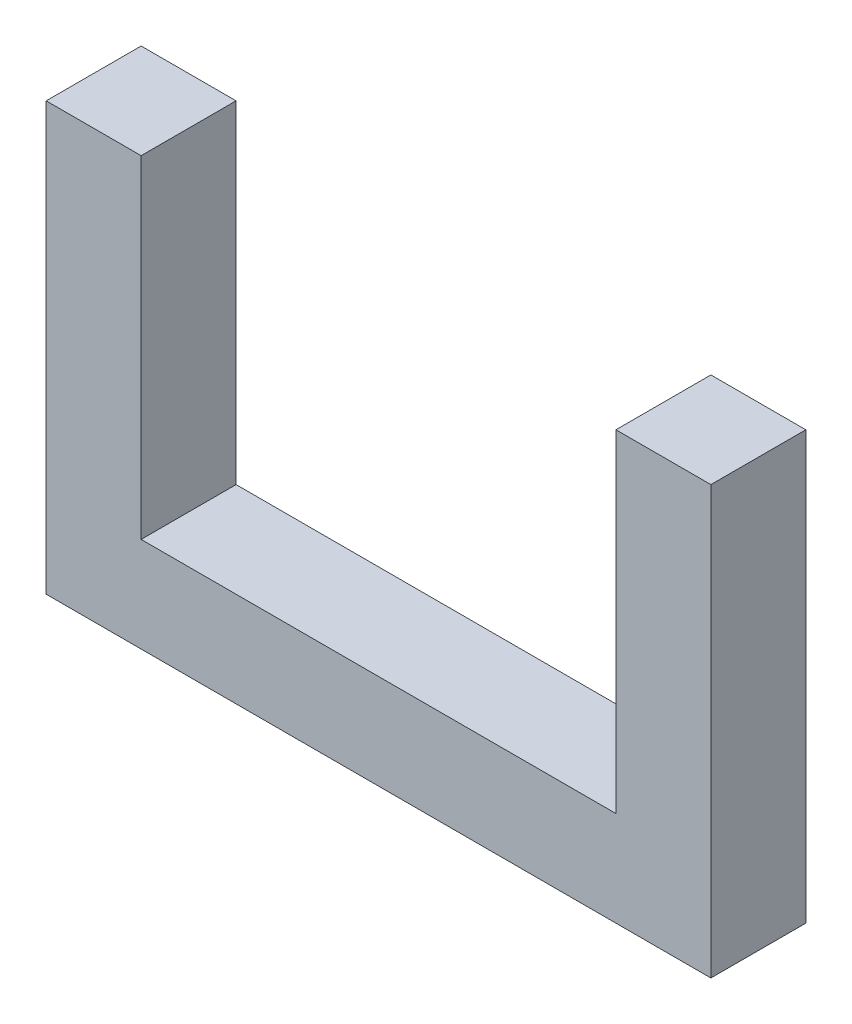
ISO-10303-21;
HEADER;
FILE_DESCRIPTION(('STEP AP214'),'2;1');
FILE_NAME('part.step','',(''),(''),'','','');
FILE_SCHEMA(('AUTOMOTIVE_DESIGN { 1 0 10303 214 1 1 1 1 }'));
ENDSEC;
DATA;
#1=APPLICATION_CONTEXT('core data for automotive mechanical design processes');
#2=APPLICATION_PROTOCOL_DEFINITION('international standard','automotive_design',2000,#1);
#3=PRODUCT_CONTEXT('',#1,'mechanical');
#4=PRODUCT('Part','Part','',(#3));
#5=PRODUCT_RELATED_PRODUCT_CATEGORY('part','',(#4));
#6=PRODUCT_DEFINITION_FORMATION('','',#4);
#7=PRODUCT_DEFINITION_CONTEXT('part definition',#1,'design');
#8=PRODUCT_DEFINITION('design','',#6,#7);
#9=PRODUCT_DEFINITION_SHAPE('','',#8);
#10=(LENGTH_UNIT() NAMED_UNIT(*) SI_UNIT(.MILLI.,.METRE.));
#11=(NAMED_UNIT(*) PLANE_ANGLE_UNIT() SI_UNIT($,.RADIAN.));
#12=(NAMED_UNIT(*) SI_UNIT($,.STERADIAN.) SOLID_ANGLE_UNIT());
#13=UNCERTAINTY_MEASURE_WITH_UNIT(LENGTH_MEASURE(1.E-05),#10,'distance_accuracy_value','');
#14=(GEOMETRIC_REPRESENTATION_CONTEXT(3) GLOBAL_UNCERTAINTY_ASSIGNED_CONTEXT((#13)) GLOBAL_UNIT_ASSIGNED_CONTEXT((#10,
#11,#12)) REPRESENTATION_CONTEXT('',''));
#15=CARTESIAN_POINT('',(0.,0.,0.));
#16=DIRECTION('',(0.,0.,1.));
#17=DIRECTION('',(1.,0.,0.));
#18=AXIS2_PLACEMENT_3D('',#15,#16,#17);
#19=CARTESIAN_POINT('',(0.,0.,0.));
#20=DIRECTION('',(0.,0.,-1.));
#21=DIRECTION('',(-1.,0.,0.));
#22=AXIS2_PLACEMENT_3D('',#19,#20,#21);
#23=PLANE('',#22);
#24=DIRECTION('',(0.,1.,0.));
#25=VECTOR('',#24,1.);
#26=CARTESIAN_POINT('',(-51.7577852851866,-9.99999999999999,0.));
#27=LINE('',#26,#25);
#28=CARTESIAN_POINT('',(-51.7577852851866,-9.99999999999999,0.));
#29=VERTEX_POINT('',#28);
#30=CARTESIAN_POINT('',(-51.7577852851866,35.,0.));
#31=VERTEX_POINT('',#30);
#32=EDGE_CURVE('E94',#29,#31,#27,.T.);
#33=ORIENTED_EDGE('',*,*,#32,.T.);
#34=DIRECTION('',(1.,0.,0.));
#35=VECTOR('',#34,1.);
#36=CARTESIAN_POINT('',(-51.7577852851866,35.,0.));
#37=LINE('',#36,#35);
#38=CARTESIAN_POINT('',(-41.7577852851866,35.,0.));
#39=VERTEX_POINT('',#38);
#40=EDGE_CURVE('E20',#31,#39,#37,.T.);
#41=ORIENTED_EDGE('',*,*,#40,.T.);
#42=DIRECTION('',(0.,1.,0.));
#43=VECTOR('',#42,1.);
#44=CARTESIAN_POINT('',(-41.7577852851866,35.,0.));
#45=LINE('',#44,#43);
#46=CARTESIAN_POINT('',(-41.7577852851866,0.,0.));
#47=VERTEX_POINT('',#46);
#48=EDGE_CURVE('E83',#39,#47,#45,.F.);
#49=ORIENTED_EDGE('',*,*,#48,.T.);
#50=DIRECTION('',(1.,0.,0.));
#51=VECTOR('',#50,1.);
#52=CARTESIAN_POINT('',(-41.7577852851866,0.,0.));
#53=LINE('',#52,#51);
#54=CARTESIAN_POINT('',(8.24221471481339,0.,0.));
#55=VERTEX_POINT('',#54);
#56=EDGE_CURVE('E78',#47,#55,#53,.T.);
#57=ORIENTED_EDGE('',*,*,#56,.T.);
#58=DIRECTION('',(0.,1.,0.));
#59=VECTOR('',#58,1.);
#60=CARTESIAN_POINT('',(8.24221471481339,0.,0.));
#61=LINE('',#60,#59);
#62=CARTESIAN_POINT('',(8.24221471481338,35.,0.));
#63=VERTEX_POINT('',#62);
#64=EDGE_CURVE('E105',#55,#63,#61,.T.);
#65=ORIENTED_EDGE('',*,*,#64,.T.);
#66=DIRECTION('',(1.,0.,0.));
#67=VECTOR('',#66,1.);
#68=CARTESIAN_POINT('',(8.24221471481338,35.,0.));
#69=LINE('',#68,#67);
#70=CARTESIAN_POINT('',(18.2422147148134,35.,0.));
#71=VERTEX_POINT('',#70);
#72=EDGE_CURVE('E110',#63,#71,#69,.T.);
#73=ORIENTED_EDGE('',*,*,#72,.T.);
#74=DIRECTION('',(0.,-1.,0.));
#75=VECTOR('',#74,1.);
#76=CARTESIAN_POINT('',(18.2422147148134,35.,0.));
#77=LINE('',#76,#75);
#78=CARTESIAN_POINT('',(18.2422147148134,-9.99999999999999,0.));
#79=VERTEX_POINT('',#78);
#80=EDGE_CURVE('E116',#71,#79,#77,.T.);
#81=ORIENTED_EDGE('',*,*,#80,.T.);
#82=DIRECTION('',(-1.,0.,0.));
#83=VECTOR('',#82,1.);
#84=CARTESIAN_POINT('',(18.2422147148134,-9.99999999999999,0.));
#85=LINE('',#84,#83);
#86=EDGE_CURVE('E122',#79,#29,#85,.T.);
#87=ORIENTED_EDGE('',*,*,#86,.T.);
#88=EDGE_LOOP('',(#33,#41,#49,#57,#65,#73,#81,#87));
#89=FACE_BOUND('',#88,.T.);
#90=ADVANCED_FACE('F17',(#89),#23,.T.);
#91=CARTESIAN_POINT('',(-51.7577852851866,35.,10.));
#92=DIRECTION('',(0.,-1.,0.));
#93=DIRECTION('',(0.,0.,-1.));
#94=AXIS2_PLACEMENT_3D('',#91,#92,#93);
#95=PLANE('',#94);
#96=DIRECTION('',(-1.,0.,0.));
#97=VECTOR('',#96,1.);
#98=CARTESIAN_POINT('',(0.,35.,10.));
#99=LINE('',#98,#97);
#100=CARTESIAN_POINT('',(-51.7577852851866,35.,10.));
#101=VERTEX_POINT('',#100);
#102=CARTESIAN_POINT('',(-41.7577852851866,35.,10.));
#103=VERTEX_POINT('',#102);
#104=EDGE_CURVE('E100',#101,#103,#99,.F.);
#105=ORIENTED_EDGE('',*,*,#104,.T.);
#106=DIRECTION('',(0.,0.,1.));
#107=VECTOR('',#106,1.);
#108=CARTESIAN_POINT('',(-41.7577852851866,35.,10.));
#109=LINE('',#108,#107);
#110=EDGE_CURVE('E88',#103,#39,#109,.F.);
#111=ORIENTED_EDGE('',*,*,#110,.T.);
#112=ORIENTED_EDGE('',*,*,#40,.F.);
#113=DIRECTION('',(0.,0.,1.));
#114=VECTOR('',#113,1.);
#115=CARTESIAN_POINT('',(-51.7577852851866,35.,10.));
#116=LINE('',#115,#114);
#117=EDGE_CURVE('E128',#31,#101,#116,.T.);
#118=ORIENTED_EDGE('',*,*,#117,.T.);
#119=EDGE_LOOP('',(#105,#111,#112,#118));
#120=FACE_BOUND('',#119,.T.);
#121=ADVANCED_FACE('F99',(#120),#95,.F.);
#122=CARTESIAN_POINT('',(-41.7577852851866,35.,10.));
#123=DIRECTION('',(-1.,0.,0.));
#124=DIRECTION('',(0.,0.,1.));
#125=AXIS2_PLACEMENT_3D('',#122,#123,#124);
#126=PLANE('',#125);
#127=DIRECTION('',(0.,1.,0.));
#128=VECTOR('',#127,1.);
#129=CARTESIAN_POINT('',(-41.7577852851866,0.,10.));
#130=LINE('',#129,#128);
#131=CARTESIAN_POINT('',(-41.7577852851866,0.,10.));
#132=VERTEX_POINT('',#131);
#133=EDGE_CURVE('E132',#103,#132,#130,.F.);
#134=ORIENTED_EDGE('',*,*,#133,.T.);
#135=DIRECTION('',(0.,0.,-1.));
#136=VECTOR('',#135,1.);
#137=CARTESIAN_POINT('',(-41.7577852851866,0.,10.));
#138=LINE('',#137,#136);
#139=EDGE_CURVE('E90',#132,#47,#138,.T.);
#140=ORIENTED_EDGE('',*,*,#139,.T.);
#141=ORIENTED_EDGE('',*,*,#48,.F.);
#142=ORIENTED_EDGE('',*,*,#110,.F.);
#143=EDGE_LOOP('',(#134,#140,#141,#142));
#144=FACE_BOUND('',#143,.T.);
#145=ADVANCED_FACE('F86',(#144),#126,.F.);
#146=CARTESIAN_POINT('',(-41.7577852851866,0.,10.));
#147=DIRECTION('',(0.,-1.,0.));
#148=DIRECTION('',(0.,0.,-1.));
#149=AXIS2_PLACEMENT_3D('',#146,#147,#148);
#150=PLANE('',#149);
#151=DIRECTION('',(-1.,0.,0.));
#152=VECTOR('',#151,1.);
#153=CARTESIAN_POINT('',(0.,0.,10.));
#154=LINE('',#153,#152);
#155=CARTESIAN_POINT('',(8.24221471481339,0.,10.));
#156=VERTEX_POINT('',#155);
#157=EDGE_CURVE('E134',#132,#156,#154,.F.);
#158=ORIENTED_EDGE('',*,*,#157,.T.);
#159=DIRECTION('',(0.,0.,1.));
#160=VECTOR('',#159,1.);
#161=CARTESIAN_POINT('',(8.24221471481339,0.,10.));
#162=LINE('',#161,#160);
#163=EDGE_CURVE('E108',#156,#55,#162,.F.);
#164=ORIENTED_EDGE('',*,*,#163,.T.);
#165=ORIENTED_EDGE('',*,*,#56,.F.);
#166=ORIENTED_EDGE('',*,*,#139,.F.);
#167=EDGE_LOOP('',(#158,#164,#165,#166));
#168=FACE_BOUND('',#167,.T.);
#169=ADVANCED_FACE('F162',(#168),#150,.F.);
#170=CARTESIAN_POINT('',(8.24221471481339,0.,10.));
#171=DIRECTION('',(1.,0.,0.));
#172=DIRECTION('',(0.,1.,0.));
#173=AXIS2_PLACEMENT_3D('',#170,#171,#172);
#174=PLANE('',#173);
#175=DIRECTION('',(0.,1.,0.));
#176=VECTOR('',#175,1.);
#177=CARTESIAN_POINT('',(8.24221471481339,0.,10.));
#178=LINE('',#177,#176);
#179=CARTESIAN_POINT('',(8.24221471481338,35.,10.));
#180=VERTEX_POINT('',#179);
#181=EDGE_CURVE('E137',#156,#180,#178,.T.);
#182=ORIENTED_EDGE('',*,*,#181,.T.);
#183=DIRECTION('',(0.,0.,-1.));
#184=VECTOR('',#183,1.);
#185=CARTESIAN_POINT('',(8.24221471481338,35.,10.));
#186=LINE('',#185,#184);
#187=EDGE_CURVE('E113',#180,#63,#186,.T.);
#188=ORIENTED_EDGE('',*,*,#187,.T.);
#189=ORIENTED_EDGE('',*,*,#64,.F.);
#190=ORIENTED_EDGE('',*,*,#163,.F.);
#191=EDGE_LOOP('',(#182,#188,#189,#190));
#192=FACE_BOUND('',#191,.T.);
#193=ADVANCED_FACE('F161',(#192),#174,.F.);
#194=CARTESIAN_POINT('',(8.24221471481338,35.,10.));
#195=DIRECTION('',(0.,-1.,0.));
#196=DIRECTION('',(0.,0.,-1.));
#197=AXIS2_PLACEMENT_3D('',#194,#195,#196);
#198=PLANE('',#197);
#199=DIRECTION('',(-1.,0.,0.));
#200=VECTOR('',#199,1.);
#201=CARTESIAN_POINT('',(0.,35.,10.));
#202=LINE('',#201,#200);
#203=CARTESIAN_POINT('',(18.2422147148134,35.,10.));
#204=VERTEX_POINT('',#203);
#205=EDGE_CURVE('E140',#180,#204,#202,.F.);
#206=ORIENTED_EDGE('',*,*,#205,.T.);
#207=DIRECTION('',(0.,0.,1.));
#208=VECTOR('',#207,1.);
#209=CARTESIAN_POINT('',(18.2422147148134,35.,10.));
#210=LINE('',#209,#208);
#211=EDGE_CURVE('E119',#204,#71,#210,.F.);
#212=ORIENTED_EDGE('',*,*,#211,.T.);
#213=ORIENTED_EDGE('',*,*,#72,.F.);
#214=ORIENTED_EDGE('',*,*,#187,.F.);
#215=EDGE_LOOP('',(#206,#212,#213,#214));
#216=FACE_BOUND('',#215,.T.);
#217=ADVANCED_FACE('F157',(#216),#198,.F.);
#218=CARTESIAN_POINT('',(18.2422147148134,35.,10.));
#219=DIRECTION('',(-1.,0.,0.));
#220=DIRECTION('',(0.,-1.,0.));
#221=AXIS2_PLACEMENT_3D('',#218,#219,#220);
#222=PLANE('',#221);
#223=DIRECTION('',(0.,1.,0.));
#224=VECTOR('',#223,1.);
#225=CARTESIAN_POINT('',(18.2422147148134,0.,10.));
#226=LINE('',#225,#224);
#227=CARTESIAN_POINT('',(18.2422147148134,-9.99999999999999,10.));
#228=VERTEX_POINT('',#227);
#229=EDGE_CURVE('E143',#204,#228,#226,.F.);
#230=ORIENTED_EDGE('',*,*,#229,.T.);
#231=DIRECTION('',(0.,0.,1.));
#232=VECTOR('',#231,1.);
#233=CARTESIAN_POINT('',(18.2422147148134,-9.99999999999999,10.));
#234=LINE('',#233,#232);
#235=EDGE_CURVE('E124',#228,#79,#234,.F.);
#236=ORIENTED_EDGE('',*,*,#235,.T.);
#237=ORIENTED_EDGE('',*,*,#80,.F.);
#238=ORIENTED_EDGE('',*,*,#211,.F.);
#239=EDGE_LOOP('',(#230,#236,#237,#238));
#240=FACE_BOUND('',#239,.T.);
#241=ADVANCED_FACE('F155',(#240),#222,.F.);
#242=CARTESIAN_POINT('',(18.2422147148134,-9.99999999999999,10.));
#243=DIRECTION('',(0.,1.,0.));
#244=DIRECTION('',(-1.,0.,0.));
#245=AXIS2_PLACEMENT_3D('',#242,#243,#244);
#246=PLANE('',#245);
#247=DIRECTION('',(-1.,0.,0.));
#248=VECTOR('',#247,1.);
#249=CARTESIAN_POINT('',(0.,-9.99999999999999,10.));
#250=LINE('',#249,#248);
#251=CARTESIAN_POINT('',(-51.7577852851866,-9.99999999999999,10.));
#252=VERTEX_POINT('',#251);
#253=EDGE_CURVE('E26',#228,#252,#250,.T.);
#254=ORIENTED_EDGE('',*,*,#253,.T.);
#255=DIRECTION('',(0.,0.,1.));
#256=VECTOR('',#255,1.);
#257=CARTESIAN_POINT('',(-51.7577852851866,-9.99999999999999,10.));
#258=LINE('',#257,#256);
#259=EDGE_CURVE('E34',#252,#29,#258,.F.);
#260=ORIENTED_EDGE('',*,*,#259,.T.);
#261=ORIENTED_EDGE('',*,*,#86,.F.);
#262=ORIENTED_EDGE('',*,*,#235,.F.);
#263=EDGE_LOOP('',(#254,#260,#261,#262));
#264=FACE_BOUND('',#263,.T.);
#265=ADVANCED_FACE('F149',(#264),#246,.F.);
#266=CARTESIAN_POINT('',(-51.7577852851866,-9.99999999999999,10.));
#267=DIRECTION('',(1.,0.,0.));
#268=DIRECTION('',(0.,1.,0.));
#269=AXIS2_PLACEMENT_3D('',#266,#267,#268);
#270=PLANE('',#269);
#271=DIRECTION('',(0.,1.,0.));
#272=VECTOR('',#271,1.);
#273=CARTESIAN_POINT('',(-51.7577852851866,0.,10.));
#274=LINE('',#273,#272);
#275=EDGE_CURVE('E11',#252,#101,#274,.T.);
#276=ORIENTED_EDGE('',*,*,#275,.T.);
#277=ORIENTED_EDGE('',*,*,#117,.F.);
#278=ORIENTED_EDGE('',*,*,#32,.F.);
#279=ORIENTED_EDGE('',*,*,#259,.F.);
#280=EDGE_LOOP('',(#276,#277,#278,#279));
#281=FACE_BOUND('',#280,.T.);
#282=ADVANCED_FACE('F163',(#281),#270,.F.);
#283=CARTESIAN_POINT('',(0.,0.,10.));
#284=DIRECTION('',(0.,0.,-1.));
#285=DIRECTION('',(-1.,0.,0.));
#286=AXIS2_PLACEMENT_3D('',#283,#284,#285);
#287=PLANE('',#286);
#288=ORIENTED_EDGE('',*,*,#253,.F.);
#289=ORIENTED_EDGE('',*,*,#229,.F.);
#290=ORIENTED_EDGE('',*,*,#205,.F.);
#291=ORIENTED_EDGE('',*,*,#181,.F.);
#292=ORIENTED_EDGE('',*,*,#157,.F.);
#293=ORIENTED_EDGE('',*,*,#133,.F.);
#294=ORIENTED_EDGE('',*,*,#104,.F.);
#295=ORIENTED_EDGE('',*,*,#275,.F.);
#296=EDGE_LOOP('',(#288,#289,#290,#291,#292,#293,#294,#295));
#297=FACE_BOUND('',#296,.T.);
#298=ADVANCED_FACE('F152',(#297),#287,.F.);
#299=CLOSED_SHELL('',(#90,#121,#145,#169,#193,#217,#241,#265,#282,#298));
#300=MANIFOLD_SOLID_BREP('B1',#299);
#301=ADVANCED_BREP_SHAPE_REPRESENTATION('',(#18,#300),#14);
#302=SHAPE_DEFINITION_REPRESENTATION(#9,#301);
ENDSEC;
END-ISO-10303-21;
